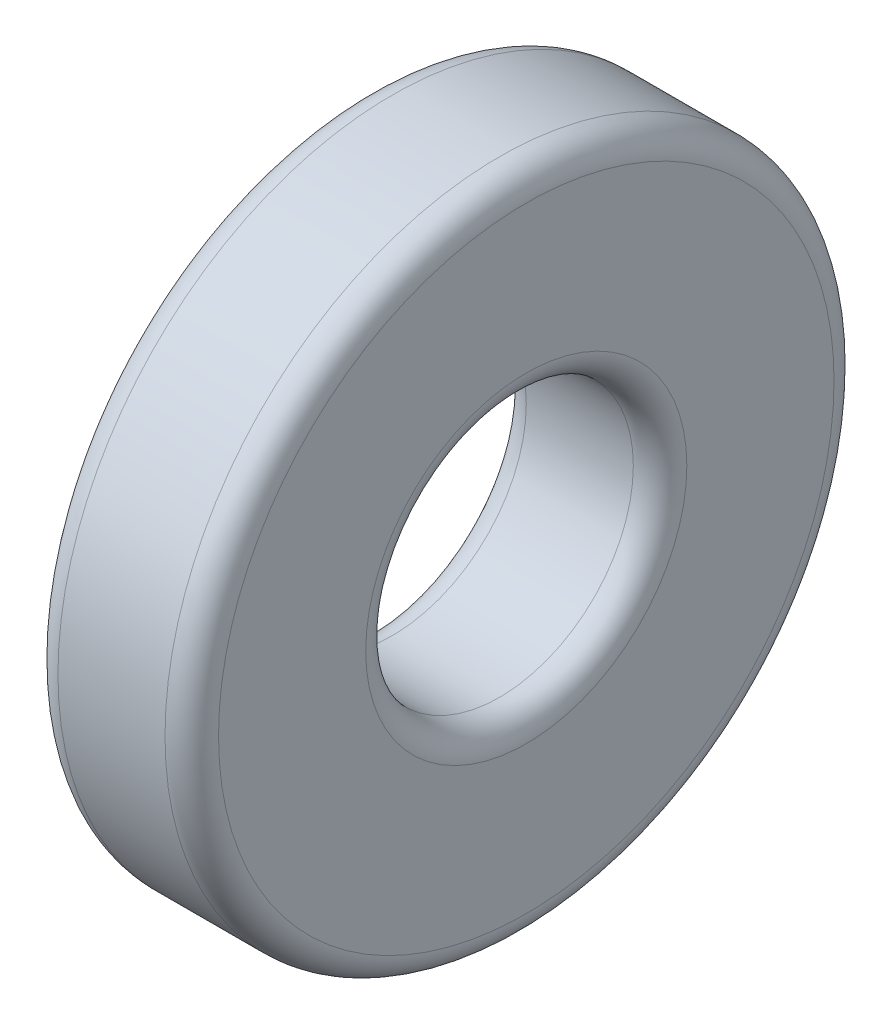
ISO-10303-21;
HEADER;
FILE_DESCRIPTION(('STEP AP214'),'2;1');
FILE_NAME('part.step','',(''),(''),'','','');
FILE_SCHEMA(('AUTOMOTIVE_DESIGN { 1 0 10303 214 1 1 1 1 }'));
ENDSEC;
DATA;
#1=APPLICATION_CONTEXT('core data for automotive mechanical design processes');
#2=APPLICATION_PROTOCOL_DEFINITION('international standard','automotive_design',2000,#1);
#3=PRODUCT_CONTEXT('',#1,'mechanical');
#4=PRODUCT('Part','Part','',(#3));
#5=PRODUCT_RELATED_PRODUCT_CATEGORY('part','',(#4));
#6=PRODUCT_DEFINITION_FORMATION('','',#4);
#7=PRODUCT_DEFINITION_CONTEXT('part definition',#1,'design');
#8=PRODUCT_DEFINITION('design','',#6,#7);
#9=PRODUCT_DEFINITION_SHAPE('','',#8);
#10=(LENGTH_UNIT() NAMED_UNIT(*) SI_UNIT(.MILLI.,.METRE.));
#11=(NAMED_UNIT(*) PLANE_ANGLE_UNIT() SI_UNIT($,.RADIAN.));
#12=(NAMED_UNIT(*) SI_UNIT($,.STERADIAN.) SOLID_ANGLE_UNIT());
#13=UNCERTAINTY_MEASURE_WITH_UNIT(LENGTH_MEASURE(1.E-05),#10,'distance_accuracy_value','');
#14=(GEOMETRIC_REPRESENTATION_CONTEXT(3) GLOBAL_UNCERTAINTY_ASSIGNED_CONTEXT((#13)) GLOBAL_UNIT_ASSIGNED_CONTEXT((#10,
#11,#12)) REPRESENTATION_CONTEXT('',''));
#15=CARTESIAN_POINT('',(0.,0.,0.));
#16=DIRECTION('',(0.,0.,1.));
#17=DIRECTION('',(1.,0.,0.));
#18=AXIS2_PLACEMENT_3D('',#15,#16,#17);
#19=CARTESIAN_POINT('',(-2.,0.,0.));
#20=DIRECTION('',(1.,0.,0.));
#21=DIRECTION('',(0.,0.,-1.));
#22=AXIS2_PLACEMENT_3D('',#19,#20,#21);
#23=TOROIDAL_SURFACE('',#22,6.,1.);
#24=CARTESIAN_POINT('',(-3.,0.,0.));
#25=DIRECTION('',(1.,0.,0.));
#26=DIRECTION('',(0.,0.,-1.));
#27=AXIS2_PLACEMENT_3D('',#24,#25,#26);
#28=CIRCLE('',#27,6.00000000000001);
#29=CARTESIAN_POINT('',(-3.,0.,-6.00000000000001));
#30=VERTEX_POINT('',#29);
#31=EDGE_CURVE('E10',#30,#30,#28,.T.);
#32=ORIENTED_EDGE('',*,*,#31,.F.);
#33=EDGE_LOOP('',(#32));
#34=FACE_BOUND('',#33,.T.);
#35=CARTESIAN_POINT('',(-1.99999999999999,0.,0.));
#36=DIRECTION('',(1.,0.,0.));
#37=DIRECTION('',(0.,0.,-1.));
#38=AXIS2_PLACEMENT_3D('',#35,#36,#37);
#39=CIRCLE('',#38,5.);
#40=CARTESIAN_POINT('',(-1.99999999999999,0.,-5.));
#41=VERTEX_POINT('',#40);
#42=EDGE_CURVE('E67',#41,#41,#39,.T.);
#43=ORIENTED_EDGE('',*,*,#42,.T.);
#44=EDGE_LOOP('',(#43));
#45=FACE_BOUND('',#44,.T.);
#46=ADVANCED_FACE('F39',(#34,#45),#23,.T.);
#47=CARTESIAN_POINT('',(-3.,0.,11.5));
#48=DIRECTION('',(1.,0.,0.));
#49=DIRECTION('',(0.,0.,-1.));
#50=AXIS2_PLACEMENT_3D('',#47,#48,#49);
#51=PLANE('',#50);
#52=CARTESIAN_POINT('',(-3.,0.,0.));
#53=DIRECTION('',(1.,0.,0.));
#54=DIRECTION('',(0.,0.,-1.));
#55=AXIS2_PLACEMENT_3D('',#52,#53,#54);
#56=CIRCLE('',#55,11.5);
#57=CARTESIAN_POINT('',(-3.,0.,-11.5));
#58=VERTEX_POINT('',#57);
#59=EDGE_CURVE('E45',#58,#58,#56,.T.);
#60=ORIENTED_EDGE('',*,*,#59,.F.);
#61=EDGE_LOOP('',(#60));
#62=FACE_BOUND('',#61,.T.);
#63=ORIENTED_EDGE('',*,*,#31,.T.);
#64=EDGE_LOOP('',(#63));
#65=FACE_BOUND('',#64,.T.);
#66=ADVANCED_FACE('F104',(#62,#65),#51,.F.);
#67=CARTESIAN_POINT('',(-2.,0.,0.));
#68=DIRECTION('',(1.,0.,0.));
#69=DIRECTION('',(0.,0.,-1.));
#70=AXIS2_PLACEMENT_3D('',#67,#68,#69);
#71=TOROIDAL_SURFACE('',#70,11.5,1.);
#72=CARTESIAN_POINT('',(-1.99999999999999,0.,0.));
#73=DIRECTION('',(1.,0.,0.));
#74=DIRECTION('',(0.,0.,-1.));
#75=AXIS2_PLACEMENT_3D('',#72,#73,#74);
#76=CIRCLE('',#75,12.5);
#77=CARTESIAN_POINT('',(-1.99999999999999,0.,-12.5));
#78=VERTEX_POINT('',#77);
#79=EDGE_CURVE('E49',#78,#78,#76,.T.);
#80=ORIENTED_EDGE('',*,*,#79,.F.);
#81=EDGE_LOOP('',(#80));
#82=FACE_BOUND('',#81,.T.);
#83=ORIENTED_EDGE('',*,*,#59,.T.);
#84=EDGE_LOOP('',(#83));
#85=FACE_BOUND('',#84,.T.);
#86=ADVANCED_FACE('F99',(#82,#85),#71,.T.);
#87=CARTESIAN_POINT('',(-3.11111111111111,0.,0.));
#88=DIRECTION('',(1.,0.,0.));
#89=DIRECTION('',(0.,0.,-1.));
#90=AXIS2_PLACEMENT_3D('',#87,#88,#89);
#91=CYLINDRICAL_SURFACE('',#90,12.5);
#92=CARTESIAN_POINT('',(1.99999999999999,0.,0.));
#93=DIRECTION('',(1.,0.,0.));
#94=DIRECTION('',(0.,0.,-1.));
#95=AXIS2_PLACEMENT_3D('',#92,#93,#94);
#96=CIRCLE('',#95,12.5);
#97=CARTESIAN_POINT('',(1.99999999999999,0.,-12.5));
#98=VERTEX_POINT('',#97);
#99=EDGE_CURVE('E53',#98,#98,#96,.T.);
#100=ORIENTED_EDGE('',*,*,#99,.F.);
#101=EDGE_LOOP('',(#100));
#102=FACE_BOUND('',#101,.T.);
#103=ORIENTED_EDGE('',*,*,#79,.T.);
#104=EDGE_LOOP('',(#103));
#105=FACE_BOUND('',#104,.T.);
#106=ADVANCED_FACE('F93',(#102,#105),#91,.T.);
#107=CARTESIAN_POINT('',(2.,0.,0.));
#108=DIRECTION('',(1.,0.,0.));
#109=DIRECTION('',(0.,0.,-1.));
#110=AXIS2_PLACEMENT_3D('',#107,#108,#109);
#111=TOROIDAL_SURFACE('',#110,11.5,1.);
#112=CARTESIAN_POINT('',(3.,0.,0.));
#113=DIRECTION('',(1.,0.,0.));
#114=DIRECTION('',(0.,0.,-1.));
#115=AXIS2_PLACEMENT_3D('',#112,#113,#114);
#116=CIRCLE('',#115,11.5);
#117=CARTESIAN_POINT('',(3.,0.,-11.5));
#118=VERTEX_POINT('',#117);
#119=EDGE_CURVE('E58',#118,#118,#116,.T.);
#120=ORIENTED_EDGE('',*,*,#119,.F.);
#121=EDGE_LOOP('',(#120));
#122=FACE_BOUND('',#121,.T.);
#123=ORIENTED_EDGE('',*,*,#99,.T.);
#124=EDGE_LOOP('',(#123));
#125=FACE_BOUND('',#124,.T.);
#126=ADVANCED_FACE('F87',(#122,#125),#111,.T.);
#127=CARTESIAN_POINT('',(3.,0.,11.5));
#128=DIRECTION('',(-1.,0.,0.));
#129=DIRECTION('',(0.,0.,1.));
#130=AXIS2_PLACEMENT_3D('',#127,#128,#129);
#131=PLANE('',#130);
#132=CARTESIAN_POINT('',(3.,0.,0.));
#133=DIRECTION('',(1.,0.,0.));
#134=DIRECTION('',(0.,0.,-1.));
#135=AXIS2_PLACEMENT_3D('',#132,#133,#134);
#136=CIRCLE('',#135,6.00000000000001);
#137=CARTESIAN_POINT('',(3.,0.,-6.00000000000001));
#138=VERTEX_POINT('',#137);
#139=EDGE_CURVE('E61',#138,#138,#136,.T.);
#140=ORIENTED_EDGE('',*,*,#139,.F.);
#141=EDGE_LOOP('',(#140));
#142=FACE_BOUND('',#141,.T.);
#143=ORIENTED_EDGE('',*,*,#119,.T.);
#144=EDGE_LOOP('',(#143));
#145=FACE_BOUND('',#144,.T.);
#146=ADVANCED_FACE('F81',(#142,#145),#131,.F.);
#147=CARTESIAN_POINT('',(2.,0.,0.));
#148=DIRECTION('',(1.,0.,0.));
#149=DIRECTION('',(0.,0.,-1.));
#150=AXIS2_PLACEMENT_3D('',#147,#148,#149);
#151=TOROIDAL_SURFACE('',#150,6.,1.);
#152=CARTESIAN_POINT('',(1.99999999999999,0.,0.));
#153=DIRECTION('',(1.,0.,0.));
#154=DIRECTION('',(0.,0.,-1.));
#155=AXIS2_PLACEMENT_3D('',#152,#153,#154);
#156=CIRCLE('',#155,5.);
#157=CARTESIAN_POINT('',(1.99999999999999,0.,-5.));
#158=VERTEX_POINT('',#157);
#159=EDGE_CURVE('E64',#158,#158,#156,.T.);
#160=ORIENTED_EDGE('',*,*,#159,.F.);
#161=EDGE_LOOP('',(#160));
#162=FACE_BOUND('',#161,.T.);
#163=ORIENTED_EDGE('',*,*,#139,.T.);
#164=EDGE_LOOP('',(#163));
#165=FACE_BOUND('',#164,.T.);
#166=ADVANCED_FACE('F75',(#162,#165),#151,.T.);
#167=CARTESIAN_POINT('',(-3.11111111111111,0.,0.));
#168=DIRECTION('',(1.,0.,0.));
#169=DIRECTION('',(0.,0.,-1.));
#170=AXIS2_PLACEMENT_3D('',#167,#168,#169);
#171=CYLINDRICAL_SURFACE('',#170,5.);
#172=ORIENTED_EDGE('',*,*,#42,.F.);
#173=EDGE_LOOP('',(#172));
#174=FACE_BOUND('',#173,.T.);
#175=ORIENTED_EDGE('',*,*,#159,.T.);
#176=EDGE_LOOP('',(#175));
#177=FACE_BOUND('',#176,.T.);
#178=ADVANCED_FACE('F72',(#174,#177),#171,.F.);
#179=CLOSED_SHELL('',(#46,#66,#86,#106,#126,#146,#166,#178));
#180=MANIFOLD_SOLID_BREP('B2',#179);
#181=ADVANCED_BREP_SHAPE_REPRESENTATION('',(#18,#180),#14);
#182=SHAPE_DEFINITION_REPRESENTATION(#9,#181);
ENDSEC;
END-ISO-10303-21;
